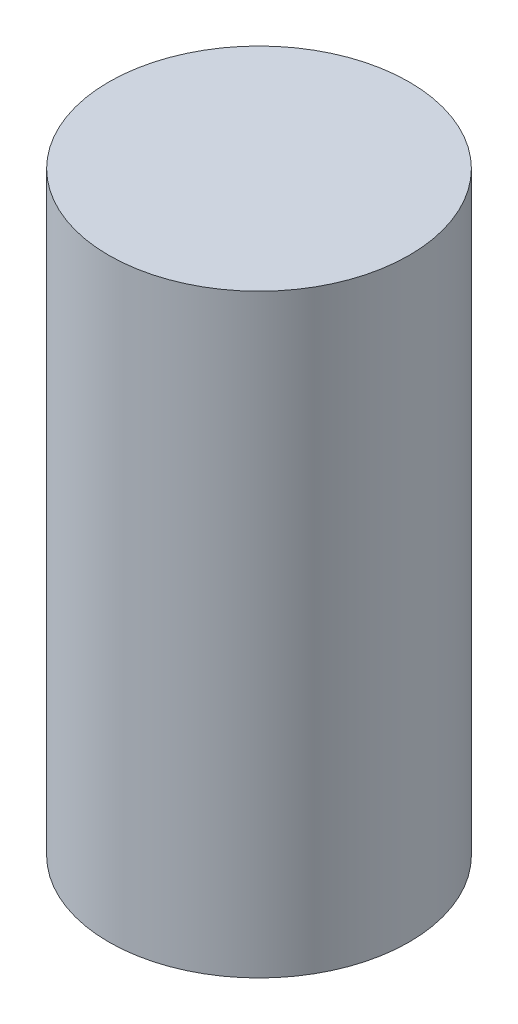
ISO-10303-21;
HEADER;
FILE_DESCRIPTION(('STEP AP214'),'2;1');
FILE_NAME('part.step','',(''),(''),'','','');
FILE_SCHEMA(('AUTOMOTIVE_DESIGN { 1 0 10303 214 1 1 1 1 }'));
ENDSEC;
DATA;
#1=APPLICATION_CONTEXT('core data for automotive mechanical design processes');
#2=APPLICATION_PROTOCOL_DEFINITION('international standard','automotive_design',2000,#1);
#3=PRODUCT_CONTEXT('',#1,'mechanical');
#4=PRODUCT('Part','Part','',(#3));
#5=PRODUCT_RELATED_PRODUCT_CATEGORY('part','',(#4));
#6=PRODUCT_DEFINITION_FORMATION('','',#4);
#7=PRODUCT_DEFINITION_CONTEXT('part definition',#1,'design');
#8=PRODUCT_DEFINITION('design','',#6,#7);
#9=PRODUCT_DEFINITION_SHAPE('','',#8);
#10=(LENGTH_UNIT() NAMED_UNIT(*) SI_UNIT(.MILLI.,.METRE.));
#11=(NAMED_UNIT(*) PLANE_ANGLE_UNIT() SI_UNIT($,.RADIAN.));
#12=(NAMED_UNIT(*) SI_UNIT($,.STERADIAN.) SOLID_ANGLE_UNIT());
#13=UNCERTAINTY_MEASURE_WITH_UNIT(LENGTH_MEASURE(1.E-05),#10,'distance_accuracy_value','');
#14=(GEOMETRIC_REPRESENTATION_CONTEXT(3) GLOBAL_UNCERTAINTY_ASSIGNED_CONTEXT((#13)) GLOBAL_UNIT_ASSIGNED_CONTEXT((#10,
#11,#12)) REPRESENTATION_CONTEXT('',''));
#15=CARTESIAN_POINT('',(0.,0.,0.));
#16=DIRECTION('',(0.,0.,1.));
#17=DIRECTION('',(1.,0.,0.));
#18=AXIS2_PLACEMENT_3D('',#15,#16,#17);
#19=CARTESIAN_POINT('',(0.,0.,0.));
#20=DIRECTION('',(0.,1.,0.));
#21=DIRECTION('',(0.,0.,1.));
#22=AXIS2_PLACEMENT_3D('',#19,#20,#21);
#23=PLANE('',#22);
#24=CARTESIAN_POINT('',(0.,0.,0.));
#25=DIRECTION('',(0.,1.,0.));
#26=DIRECTION('',(0.,0.,1.));
#27=AXIS2_PLACEMENT_3D('',#24,#25,#26);
#28=CIRCLE('',#27,5.);
#29=CARTESIAN_POINT('',(0.,0.,-5.));
#30=VERTEX_POINT('',#29);
#31=EDGE_CURVE('E10',#30,#30,#28,.T.);
#32=ORIENTED_EDGE('',*,*,#31,.F.);
#33=EDGE_LOOP('',(#32));
#34=FACE_BOUND('',#33,.T.);
#35=CARTESIAN_POINT('',(0.,0.,0.));
#36=DIRECTION('',(0.,1.,0.));
#37=DIRECTION('',(0.,0.,1.));
#38=AXIS2_PLACEMENT_3D('',#35,#36,#37);
#39=CIRCLE('',#38,2.75);
#40=CARTESIAN_POINT('',(0.,0.,-2.75));
#41=VERTEX_POINT('',#40);
#42=EDGE_CURVE('E40',#41,#41,#39,.T.);
#43=ORIENTED_EDGE('',*,*,#42,.T.);
#44=EDGE_LOOP('',(#43));
#45=FACE_BOUND('',#44,.T.);
#46=ADVANCED_FACE('F33',(#34,#45),#23,.F.);
#47=CARTESIAN_POINT('',(0.,3.8,0.));
#48=DIRECTION('',(0.,-1.,0.));
#49=DIRECTION('',(0.,0.,-1.));
#50=AXIS2_PLACEMENT_3D('',#47,#48,#49);
#51=CYLINDRICAL_SURFACE('',#50,5.);
#52=CARTESIAN_POINT('',(0.,19.8,0.));
#53=DIRECTION('',(0.,1.,0.));
#54=DIRECTION('',(0.,0.,1.));
#55=AXIS2_PLACEMENT_3D('',#52,#53,#54);
#56=CIRCLE('',#55,5.);
#57=CARTESIAN_POINT('',(0.,19.8,-5.));
#58=VERTEX_POINT('',#57);
#59=EDGE_CURVE('E48',#58,#58,#56,.T.);
#60=CARTESIAN_POINT('',(0.,0.,-5.));
#61=CARTESIAN_POINT('',(0.,0.20625,-5.));
#62=CARTESIAN_POINT('',(0.,0.4125,-5.));
#63=CARTESIAN_POINT('',(0.,0.825,-5.));
#64=CARTESIAN_POINT('',(0.,1.03125,-5.));
#65=CARTESIAN_POINT('',(0.,1.44375,-5.));
#66=CARTESIAN_POINT('',(0.,1.65,-5.));
#67=CARTESIAN_POINT('',(0.,2.0625,-5.));
#68=CARTESIAN_POINT('',(0.,2.26875,-5.));
#69=CARTESIAN_POINT('',(0.,2.68125,-5.));
#70=CARTESIAN_POINT('',(0.,2.8875,-5.));
#71=CARTESIAN_POINT('',(0.,3.3,-5.));
#72=CARTESIAN_POINT('',(0.,3.50625,-5.));
#73=CARTESIAN_POINT('',(0.,3.91875,-5.));
#74=CARTESIAN_POINT('',(0.,4.125,-5.));
#75=CARTESIAN_POINT('',(0.,4.5375,-5.));
#76=CARTESIAN_POINT('',(0.,4.74375,-5.));
#77=CARTESIAN_POINT('',(0.,5.15625,-5.));
#78=CARTESIAN_POINT('',(0.,5.3625,-5.));
#79=CARTESIAN_POINT('',(0.,5.775,-5.));
#80=CARTESIAN_POINT('',(0.,5.98125,-5.));
#81=CARTESIAN_POINT('',(0.,6.39375,-5.));
#82=CARTESIAN_POINT('',(0.,6.6,-5.));
#83=CARTESIAN_POINT('',(0.,7.0125,-5.));
#84=CARTESIAN_POINT('',(0.,7.21875,-5.));
#85=CARTESIAN_POINT('',(0.,7.63125,-5.));
#86=CARTESIAN_POINT('',(0.,7.8375,-5.));
#87=CARTESIAN_POINT('',(0.,8.25,-5.));
#88=CARTESIAN_POINT('',(0.,8.45625,-5.));
#89=CARTESIAN_POINT('',(0.,8.86875,-5.));
#90=CARTESIAN_POINT('',(0.,9.075,-5.));
#91=CARTESIAN_POINT('',(0.,9.4875,-5.));
#92=CARTESIAN_POINT('',(0.,9.69375,-5.));
#93=CARTESIAN_POINT('',(0.,10.10625,-5.));
#94=CARTESIAN_POINT('',(0.,10.3125,-5.));
#95=CARTESIAN_POINT('',(0.,10.725,-5.));
#96=CARTESIAN_POINT('',(0.,10.93125,-5.));
#97=CARTESIAN_POINT('',(0.,11.34375,-5.));
#98=CARTESIAN_POINT('',(0.,11.55,-5.));
#99=CARTESIAN_POINT('',(0.,11.9625,-5.));
#100=CARTESIAN_POINT('',(0.,12.16875,-5.));
#101=CARTESIAN_POINT('',(0.,12.58125,-5.));
#102=CARTESIAN_POINT('',(0.,12.7875,-5.));
#103=CARTESIAN_POINT('',(0.,13.2,-5.));
#104=CARTESIAN_POINT('',(0.,13.40625,-5.));
#105=CARTESIAN_POINT('',(0.,13.81875,-5.));
#106=CARTESIAN_POINT('',(0.,14.025,-5.));
#107=CARTESIAN_POINT('',(0.,14.4375,-5.));
#108=CARTESIAN_POINT('',(0.,14.64375,-5.));
#109=CARTESIAN_POINT('',(0.,15.05625,-5.));
#110=CARTESIAN_POINT('',(0.,15.2625,-5.));
#111=CARTESIAN_POINT('',(0.,15.675,-5.));
#112=CARTESIAN_POINT('',(0.,15.88125,-5.));
#113=CARTESIAN_POINT('',(0.,16.29375,-5.));
#114=CARTESIAN_POINT('',(0.,16.5,-5.));
#115=CARTESIAN_POINT('',(0.,16.9125,-5.));
#116=CARTESIAN_POINT('',(0.,17.11875,-5.));
#117=CARTESIAN_POINT('',(0.,17.53125,-5.));
#118=CARTESIAN_POINT('',(0.,17.7375,-5.));
#119=CARTESIAN_POINT('',(0.,18.15,-5.));
#120=CARTESIAN_POINT('',(0.,18.35625,-5.));
#121=CARTESIAN_POINT('',(0.,18.76875,-5.));
#122=CARTESIAN_POINT('',(0.,18.975,-5.));
#123=CARTESIAN_POINT('',(0.,19.3875,-5.));
#124=CARTESIAN_POINT('',(0.,19.59375,-5.));
#125=CARTESIAN_POINT('',(0.,19.8,-5.));
#126=B_SPLINE_CURVE_WITH_KNOTS('',3,(#60,#61,#62,#63,#64,#65,#66,#67,#68,#69,#70,#71,#72,#73,
#74,#75,#76,#77,#78,#79,#80,#81,#82,#83,#84,#85,#86,#87,#88,#89,#90,#91,#92,#93,#94,#95,#96,#97,
#98,#99,#100,#101,#102,#103,#104,#105,#106,#107,#108,#109,#110,#111,#112,#113,#114,#115,#116,
#117,#118,#119,#120,#121,#122,#123,#124,#125),.UNSPECIFIED.,.F.,.F.,(4,2,2,2,2,2,2,2,2,2,2,2,2,
2,2,2,2,2,2,2,2,2,2,2,2,2,2,2,2,2,2,2,4),(0.,0.61875,1.2375,1.85625,2.475,3.09375,3.7125,
4.33125,4.95,5.56875,6.1875,6.80625,7.425,8.04375,8.6625,9.28125,9.9,10.51875,11.1375,11.75625,
12.375,12.99375,13.6125,14.23125,14.85,15.46875,16.0875,16.70625,17.325,17.94375,18.5625,
19.18125,19.8),.UNSPECIFIED.);
#127=EDGE_CURVE('BSEAM35',#30,#58,#126,.T.);
#128=ORIENTED_EDGE('',*,*,#31,.T.);
#129=ORIENTED_EDGE('',*,*,#59,.F.);
#130=ORIENTED_EDGE('',*,*,#127,.T.);
#131=ORIENTED_EDGE('',*,*,#127,.F.);
#132=EDGE_LOOP('',(#128,#130,#129,#131));
#133=FACE_BOUND('',#132,.T.);
#134=ADVANCED_FACE('F35',(#133),#51,.T.);
#135=CARTESIAN_POINT('',(0.,3.8,0.));
#136=DIRECTION('',(0.,-1.,0.));
#137=DIRECTION('',(0.,0.,-1.));
#138=AXIS2_PLACEMENT_3D('',#135,#136,#137);
#139=CYLINDRICAL_SURFACE('',#138,2.75);
#140=CARTESIAN_POINT('',(0.,3.8,0.));
#141=DIRECTION('',(0.,1.,0.));
#142=DIRECTION('',(0.,0.,1.));
#143=AXIS2_PLACEMENT_3D('',#140,#141,#142);
#144=CIRCLE('',#143,2.75);
#145=CARTESIAN_POINT('',(0.,3.8,-2.75));
#146=VERTEX_POINT('',#145);
#147=EDGE_CURVE('E44',#146,#146,#144,.T.);
#148=CARTESIAN_POINT('',(0.,3.8,-2.75));
#149=CARTESIAN_POINT('',(0.,3.76041666666667,-2.75));
#150=CARTESIAN_POINT('',(0.,3.72083333333333,-2.75));
#151=CARTESIAN_POINT('',(0.,3.64166666666667,-2.75));
#152=CARTESIAN_POINT('',(0.,3.60208333333333,-2.75));
#153=CARTESIAN_POINT('',(0.,3.52291666666667,-2.75));
#154=CARTESIAN_POINT('',(0.,3.48333333333333,-2.75));
#155=CARTESIAN_POINT('',(0.,3.40416666666667,-2.75));
#156=CARTESIAN_POINT('',(0.,3.36458333333333,-2.75));
#157=CARTESIAN_POINT('',(0.,3.28541666666667,-2.75));
#158=CARTESIAN_POINT('',(0.,3.24583333333333,-2.75));
#159=CARTESIAN_POINT('',(0.,3.16666666666667,-2.75));
#160=CARTESIAN_POINT('',(0.,3.12708333333333,-2.75));
#161=CARTESIAN_POINT('',(0.,3.04791666666667,-2.75));
#162=CARTESIAN_POINT('',(0.,3.00833333333333,-2.75));
#163=CARTESIAN_POINT('',(0.,2.92916666666667,-2.75));
#164=CARTESIAN_POINT('',(0.,2.88958333333333,-2.75));
#165=CARTESIAN_POINT('',(0.,2.81041666666667,-2.75));
#166=CARTESIAN_POINT('',(0.,2.77083333333333,-2.75));
#167=CARTESIAN_POINT('',(0.,2.69166666666667,-2.75));
#168=CARTESIAN_POINT('',(0.,2.65208333333333,-2.75));
#169=CARTESIAN_POINT('',(0.,2.57291666666667,-2.75));
#170=CARTESIAN_POINT('',(0.,2.53333333333333,-2.75));
#171=CARTESIAN_POINT('',(0.,2.45416666666667,-2.75));
#172=CARTESIAN_POINT('',(0.,2.41458333333333,-2.75));
#173=CARTESIAN_POINT('',(0.,2.33541666666667,-2.75));
#174=CARTESIAN_POINT('',(0.,2.29583333333333,-2.75));
#175=CARTESIAN_POINT('',(0.,2.21666666666667,-2.75));
#176=CARTESIAN_POINT('',(0.,2.17708333333333,-2.75));
#177=CARTESIAN_POINT('',(0.,2.09791666666667,-2.75));
#178=CARTESIAN_POINT('',(0.,2.05833333333333,-2.75));
#179=CARTESIAN_POINT('',(0.,1.97916666666667,-2.75));
#180=CARTESIAN_POINT('',(0.,1.93958333333333,-2.75));
#181=CARTESIAN_POINT('',(0.,1.86041666666667,-2.75));
#182=CARTESIAN_POINT('',(0.,1.82083333333333,-2.75));
#183=CARTESIAN_POINT('',(0.,1.74166666666667,-2.75));
#184=CARTESIAN_POINT('',(0.,1.70208333333333,-2.75));
#185=CARTESIAN_POINT('',(0.,1.62291666666667,-2.75));
#186=CARTESIAN_POINT('',(0.,1.58333333333333,-2.75));
#187=CARTESIAN_POINT('',(0.,1.50416666666667,-2.75));
#188=CARTESIAN_POINT('',(0.,1.46458333333333,-2.75));
#189=CARTESIAN_POINT('',(0.,1.38541666666667,-2.75));
#190=CARTESIAN_POINT('',(0.,1.34583333333333,-2.75));
#191=CARTESIAN_POINT('',(0.,1.26666666666667,-2.75));
#192=CARTESIAN_POINT('',(0.,1.22708333333333,-2.75));
#193=CARTESIAN_POINT('',(0.,1.14791666666667,-2.75));
#194=CARTESIAN_POINT('',(0.,1.10833333333333,-2.75));
#195=CARTESIAN_POINT('',(0.,1.02916666666667,-2.75));
#196=CARTESIAN_POINT('',(0.,0.989583333333333,-2.75));
#197=CARTESIAN_POINT('',(0.,0.910416666666667,-2.75));
#198=CARTESIAN_POINT('',(0.,0.870833333333333,-2.75));
#199=CARTESIAN_POINT('',(0.,0.791666666666667,-2.75));
#200=CARTESIAN_POINT('',(0.,0.752083333333333,-2.75));
#201=CARTESIAN_POINT('',(0.,0.672916666666667,-2.75));
#202=CARTESIAN_POINT('',(0.,0.633333333333333,-2.75));
#203=CARTESIAN_POINT('',(0.,0.554166666666667,-2.75));
#204=CARTESIAN_POINT('',(0.,0.514583333333334,-2.75));
#205=CARTESIAN_POINT('',(0.,0.435416666666667,-2.75));
#206=CARTESIAN_POINT('',(0.,0.395833333333333,-2.75));
#207=CARTESIAN_POINT('',(0.,0.316666666666666,-2.75));
#208=CARTESIAN_POINT('',(0.,0.277083333333333,-2.75));
#209=CARTESIAN_POINT('',(0.,0.197916666666667,-2.75));
#210=CARTESIAN_POINT('',(0.,0.158333333333333,-2.75));
#211=CARTESIAN_POINT('',(0.,0.0791666666666666,-2.75));
#212=CARTESIAN_POINT('',(0.,0.0395833333333333,-2.75));
#213=CARTESIAN_POINT('',(0.,0.,-2.75));
#214=B_SPLINE_CURVE_WITH_KNOTS('',3,(#148,#149,#150,#151,#152,#153,#154,#155,#156,#157,#158,
#159,#160,#161,#162,#163,#164,#165,#166,#167,#168,#169,#170,#171,#172,#173,#174,#175,#176,#177,
#178,#179,#180,#181,#182,#183,#184,#185,#186,#187,#188,#189,#190,#191,#192,#193,#194,#195,#196,
#197,#198,#199,#200,#201,#202,#203,#204,#205,#206,#207,#208,#209,#210,#211,#212,#213),
.UNSPECIFIED.,.F.,.F.,(4,2,2,2,2,2,2,2,2,2,2,2,2,2,2,2,2,2,2,2,2,2,2,2,2,2,2,2,2,2,2,2,4),(0.,
0.11875,0.2375,0.35625,0.475,0.59375,0.7125,0.831249999999999,0.95,1.06875,1.1875,1.30625,1.425,
1.54375,1.6625,1.78125,1.9,2.01875,2.1375,2.25625,2.375,2.49375,2.6125,2.73125,2.85,2.96875,
3.0875,3.20625,3.325,3.44375,3.5625,3.68125,3.8),.UNSPECIFIED.);
#215=EDGE_CURVE('BSEAM57',#146,#41,#214,.T.);
#216=ORIENTED_EDGE('',*,*,#147,.T.);
#217=ORIENTED_EDGE('',*,*,#42,.F.);
#218=ORIENTED_EDGE('',*,*,#215,.T.);
#219=ORIENTED_EDGE('',*,*,#215,.F.);
#220=EDGE_LOOP('',(#216,#218,#217,#219));
#221=FACE_BOUND('',#220,.T.);
#222=ADVANCED_FACE('F57',(#221),#139,.F.);
#223=CARTESIAN_POINT('',(0.,3.8,0.));
#224=DIRECTION('',(0.,1.,0.));
#225=DIRECTION('',(0.,0.,1.));
#226=AXIS2_PLACEMENT_3D('',#223,#224,#225);
#227=PLANE('',#226);
#228=ORIENTED_EDGE('',*,*,#147,.F.);
#229=EDGE_LOOP('',(#228));
#230=FACE_BOUND('',#229,.T.);
#231=ADVANCED_FACE('F62',(#230),#227,.F.);
#232=CARTESIAN_POINT('',(0.,19.8,0.));
#233=DIRECTION('',(0.,1.,0.));
#234=DIRECTION('',(0.,0.,1.));
#235=AXIS2_PLACEMENT_3D('',#232,#233,#234);
#236=PLANE('',#235);
#237=ORIENTED_EDGE('',*,*,#59,.T.);
#238=EDGE_LOOP('',(#237));
#239=FACE_BOUND('',#238,.T.);
#240=ADVANCED_FACE('F54',(#239),#236,.T.);
#241=CLOSED_SHELL('',(#46,#134,#222,#231,#240));
#242=MANIFOLD_SOLID_BREP('B2',#241);
#243=ADVANCED_BREP_SHAPE_REPRESENTATION('',(#18,#242),#14);
#244=SHAPE_DEFINITION_REPRESENTATION(#9,#243);
ENDSEC;
END-ISO-10303-21;
